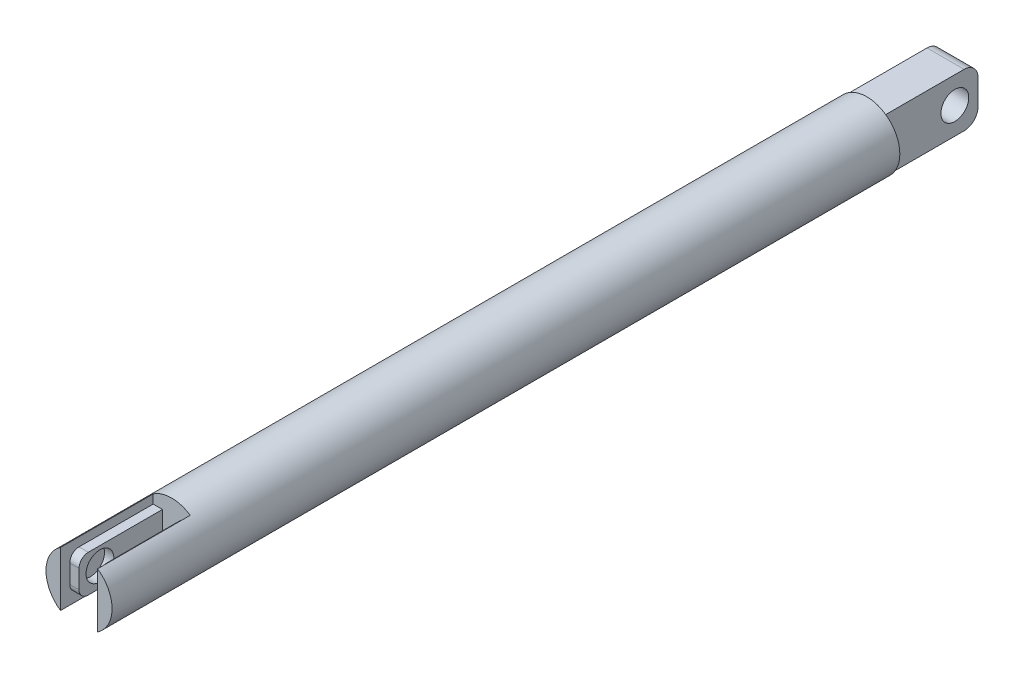
ISO-10303-21;
HEADER;
FILE_DESCRIPTION(('STEP AP214'),'2;1');
FILE_NAME('part.step','',(''),(''),'','','');
FILE_SCHEMA(('AUTOMOTIVE_DESIGN { 1 0 10303 214 1 1 1 1 }'));
ENDSEC;
DATA;
#1=APPLICATION_CONTEXT('core data for automotive mechanical design processes');
#2=APPLICATION_PROTOCOL_DEFINITION('international standard','automotive_design',2000,#1);
#3=PRODUCT_CONTEXT('',#1,'mechanical');
#4=PRODUCT('Part','Part','',(#3));
#5=PRODUCT_RELATED_PRODUCT_CATEGORY('part','',(#4));
#6=PRODUCT_DEFINITION_FORMATION('','',#4);
#7=PRODUCT_DEFINITION_CONTEXT('part definition',#1,'design');
#8=PRODUCT_DEFINITION('design','',#6,#7);
#9=PRODUCT_DEFINITION_SHAPE('','',#8);
#10=(LENGTH_UNIT() NAMED_UNIT(*) SI_UNIT(.MILLI.,.METRE.));
#11=(NAMED_UNIT(*) PLANE_ANGLE_UNIT() SI_UNIT($,.RADIAN.));
#12=(NAMED_UNIT(*) SI_UNIT($,.STERADIAN.) SOLID_ANGLE_UNIT());
#13=UNCERTAINTY_MEASURE_WITH_UNIT(LENGTH_MEASURE(1.E-05),#10,'distance_accuracy_value','');
#14=(GEOMETRIC_REPRESENTATION_CONTEXT(3) GLOBAL_UNCERTAINTY_ASSIGNED_CONTEXT((#13)) GLOBAL_UNIT_ASSIGNED_CONTEXT((#10,
#11,#12)) REPRESENTATION_CONTEXT('',''));
#15=CARTESIAN_POINT('',(0.,0.,0.));
#16=DIRECTION('',(0.,0.,1.));
#17=DIRECTION('',(1.,0.,0.));
#18=AXIS2_PLACEMENT_3D('',#15,#16,#17);
#19=CARTESIAN_POINT('',(4.,2.75,-167.));
#20=DIRECTION('',(-1.,0.,0.));
#21=DIRECTION('',(0.,0.,1.));
#22=AXIS2_PLACEMENT_3D('',#19,#20,#21);
#23=CYLINDRICAL_SURFACE('',#22,3.);
#24=DIRECTION('',(-1.,0.,0.));
#25=VECTOR('',#24,1.);
#26=CARTESIAN_POINT('',(4.,5.75,-167.));
#27=LINE('',#26,#25);
#28=CARTESIAN_POINT('',(4.,5.75,-167.));
#29=VERTEX_POINT('',#28);
#30=CARTESIAN_POINT('',(-4.,5.75,-167.));
#31=VERTEX_POINT('',#30);
#32=EDGE_CURVE('E197',#29,#31,#27,.T.);
#33=ORIENTED_EDGE('',*,*,#32,.F.);
#34=CARTESIAN_POINT('',(4.,2.75,-167.));
#35=DIRECTION('',(1.,0.,0.));
#36=DIRECTION('',(0.,0.,-1.));
#37=AXIS2_PLACEMENT_3D('',#34,#35,#36);
#38=CIRCLE('',#37,3.);
#39=CARTESIAN_POINT('',(4.,2.75,-170.));
#40=VERTEX_POINT('',#39);
#41=EDGE_CURVE('E51',#40,#29,#38,.T.);
#42=ORIENTED_EDGE('',*,*,#41,.F.);
#43=DIRECTION('',(-1.,0.,0.));
#44=VECTOR('',#43,1.);
#45=CARTESIAN_POINT('',(0.,2.75,-170.));
#46=LINE('',#45,#44);
#47=CARTESIAN_POINT('',(-4.,2.75,-170.));
#48=VERTEX_POINT('',#47);
#49=EDGE_CURVE('E373',#48,#40,#46,.F.);
#50=ORIENTED_EDGE('',*,*,#49,.F.);
#51=CARTESIAN_POINT('',(-4.,2.75,-167.));
#52=DIRECTION('',(1.,0.,0.));
#53=DIRECTION('',(0.,0.,-1.));
#54=AXIS2_PLACEMENT_3D('',#51,#52,#53);
#55=CIRCLE('',#54,3.);
#56=EDGE_CURVE('E11',#31,#48,#55,.F.);
#57=ORIENTED_EDGE('',*,*,#56,.F.);
#58=EDGE_LOOP('',(#33,#42,#50,#57));
#59=FACE_BOUND('',#58,.T.);
#60=ADVANCED_FACE('F43',(#59),#23,.T.);
#61=CARTESIAN_POINT('',(0.,-2.75,-167.));
#62=DIRECTION('',(1.,0.,0.));
#63=DIRECTION('',(0.,0.,-1.));
#64=AXIS2_PLACEMENT_3D('',#61,#62,#63);
#65=CYLINDRICAL_SURFACE('',#64,3.);
#66=DIRECTION('',(-1.,0.,0.));
#67=VECTOR('',#66,1.);
#68=CARTESIAN_POINT('',(0.,-2.75,-170.));
#69=LINE('',#68,#67);
#70=CARTESIAN_POINT('',(4.,-2.75,-170.));
#71=VERTEX_POINT('',#70);
#72=CARTESIAN_POINT('',(-4.,-2.75,-170.));
#73=VERTEX_POINT('',#72);
#74=EDGE_CURVE('E360',#71,#73,#69,.T.);
#75=ORIENTED_EDGE('',*,*,#74,.F.);
#76=CARTESIAN_POINT('',(4.,-2.75,-167.));
#77=DIRECTION('',(1.,0.,0.));
#78=DIRECTION('',(0.,0.,-1.));
#79=AXIS2_PLACEMENT_3D('',#76,#77,#78);
#80=CIRCLE('',#79,3.);
#81=CARTESIAN_POINT('',(4.,-5.75,-167.));
#82=VERTEX_POINT('',#81);
#83=EDGE_CURVE('E368',#82,#71,#80,.T.);
#84=ORIENTED_EDGE('',*,*,#83,.F.);
#85=DIRECTION('',(-1.,0.,0.));
#86=VECTOR('',#85,1.);
#87=CARTESIAN_POINT('',(0.,-5.75,-167.));
#88=LINE('',#87,#86);
#89=CARTESIAN_POINT('',(-4.,-5.75,-167.));
#90=VERTEX_POINT('',#89);
#91=EDGE_CURVE('E365',#90,#82,#88,.F.);
#92=ORIENTED_EDGE('',*,*,#91,.F.);
#93=CARTESIAN_POINT('',(-4.,-2.75,-167.));
#94=DIRECTION('',(1.,0.,0.));
#95=DIRECTION('',(0.,0.,-1.));
#96=AXIS2_PLACEMENT_3D('',#93,#94,#95);
#97=CIRCLE('',#96,3.);
#98=EDGE_CURVE('E370',#73,#90,#97,.F.);
#99=ORIENTED_EDGE('',*,*,#98,.F.);
#100=EDGE_LOOP('',(#75,#84,#92,#99));
#101=FACE_BOUND('',#100,.T.);
#102=ADVANCED_FACE('F405',(#101),#65,.T.);
#103=CARTESIAN_POINT('',(0.,0.,0.));
#104=DIRECTION('',(0.,0.,1.));
#105=DIRECTION('',(1.,0.,0.));
#106=AXIS2_PLACEMENT_3D('',#103,#104,#105);
#107=PLANE('',#106);
#108=CARTESIAN_POINT('',(0.,0.,0.));
#109=DIRECTION('',(0.,0.,1.));
#110=DIRECTION('',(1.,0.,0.));
#111=AXIS2_PLACEMENT_3D('',#108,#109,#110);
#112=CIRCLE('',#111,7.12948345739197);
#113=CARTESIAN_POINT('',(-3.99999999999998,-5.90165522283587,0.));
#114=VERTEX_POINT('',#113);
#115=CARTESIAN_POINT('',(4.00000000000002,-5.90165522283584,0.));
#116=VERTEX_POINT('',#115);
#117=EDGE_CURVE('E299',#114,#116,#112,.T.);
#118=ORIENTED_EDGE('',*,*,#117,.T.);
#119=DIRECTION('',(0.,-1.,0.));
#120=VECTOR('',#119,1.);
#121=CARTESIAN_POINT('',(4.,0.,0.));
#122=LINE('',#121,#120);
#123=CARTESIAN_POINT('',(4.,-4.,0.));
#124=VERTEX_POINT('',#123);
#125=EDGE_CURVE('E225',#124,#116,#122,.T.);
#126=ORIENTED_EDGE('',*,*,#125,.F.);
#127=DIRECTION('',(1.,0.,0.));
#128=VECTOR('',#127,1.);
#129=CARTESIAN_POINT('',(0.,-4.,0.));
#130=LINE('',#129,#128);
#131=CARTESIAN_POINT('',(2.,-4.,0.));
#132=VERTEX_POINT('',#131);
#133=EDGE_CURVE('E282',#132,#124,#130,.T.);
#134=ORIENTED_EDGE('',*,*,#133,.F.);
#135=DIRECTION('',(0.,1.,0.));
#136=VECTOR('',#135,1.);
#137=CARTESIAN_POINT('',(2.,0.,0.));
#138=LINE('',#137,#136);
#139=CARTESIAN_POINT('',(2.,4.,0.));
#140=VERTEX_POINT('',#139);
#141=EDGE_CURVE('E279',#132,#140,#138,.T.);
#142=ORIENTED_EDGE('',*,*,#141,.T.);
#143=DIRECTION('',(1.,0.,0.));
#144=VECTOR('',#143,1.);
#145=CARTESIAN_POINT('',(0.,4.,0.));
#146=LINE('',#145,#144);
#147=CARTESIAN_POINT('',(4.,4.,0.));
#148=VERTEX_POINT('',#147);
#149=EDGE_CURVE('E276',#140,#148,#146,.T.);
#150=ORIENTED_EDGE('',*,*,#149,.T.);
#151=CARTESIAN_POINT('',(3.99999999999998,5.90165522283587,0.));
#152=VERTEX_POINT('',#151);
#153=EDGE_CURVE('E233',#152,#148,#122,.T.);
#154=ORIENTED_EDGE('',*,*,#153,.F.);
#155=CARTESIAN_POINT('',(-4.00000000000002,5.90165522283584,0.));
#156=VERTEX_POINT('',#155);
#157=EDGE_CURVE('E294',#152,#156,#112,.T.);
#158=ORIENTED_EDGE('',*,*,#157,.T.);
#159=DIRECTION('',(0.,-1.,0.));
#160=VECTOR('',#159,1.);
#161=CARTESIAN_POINT('',(-4.,0.,0.));
#162=LINE('',#161,#160);
#163=CARTESIAN_POINT('',(-4.00000000000001,4.,0.));
#164=VERTEX_POINT('',#163);
#165=EDGE_CURVE('E249',#156,#164,#162,.T.);
#166=ORIENTED_EDGE('',*,*,#165,.T.);
#167=DIRECTION('',(-1.,0.,0.));
#168=VECTOR('',#167,1.);
#169=CARTESIAN_POINT('',(0.,4.,0.));
#170=LINE('',#169,#168);
#171=CARTESIAN_POINT('',(-2.,4.,0.));
#172=VERTEX_POINT('',#171);
#173=EDGE_CURVE('E298',#172,#164,#170,.T.);
#174=ORIENTED_EDGE('',*,*,#173,.F.);
#175=DIRECTION('',(0.,1.,0.));
#176=VECTOR('',#175,1.);
#177=CARTESIAN_POINT('',(-2.,0.,0.));
#178=LINE('',#177,#176);
#179=CARTESIAN_POINT('',(-2.,-4.,0.));
#180=VERTEX_POINT('',#179);
#181=EDGE_CURVE('E307',#180,#172,#178,.T.);
#182=ORIENTED_EDGE('',*,*,#181,.F.);
#183=DIRECTION('',(-1.,0.,0.));
#184=VECTOR('',#183,1.);
#185=CARTESIAN_POINT('',(0.,-4.,0.));
#186=LINE('',#185,#184);
#187=CARTESIAN_POINT('',(-3.99999999999998,-4.,0.));
#188=VERTEX_POINT('',#187);
#189=EDGE_CURVE('E304',#180,#188,#186,.T.);
#190=ORIENTED_EDGE('',*,*,#189,.T.);
#191=EDGE_CURVE('E244',#188,#114,#162,.T.);
#192=ORIENTED_EDGE('',*,*,#191,.T.);
#193=EDGE_LOOP('',(#118,#126,#134,#142,#150,#154,#158,#166,#174,#182,#190,#192));
#194=FACE_BOUND('',#193,.T.);
#195=ADVANCED_FACE('F409',(#194),#107,.T.);
#196=CARTESIAN_POINT('',(0.,2.,16.));
#197=DIRECTION('',(1.,0.,0.));
#198=DIRECTION('',(0.,0.,-1.));
#199=AXIS2_PLACEMENT_3D('',#196,#197,#198);
#200=CYLINDRICAL_SURFACE('',#199,2.);
#201=DIRECTION('',(1.,0.,0.));
#202=VECTOR('',#201,1.);
#203=CARTESIAN_POINT('',(0.,4.,16.));
#204=LINE('',#203,#202);
#205=CARTESIAN_POINT('',(2.,4.,16.));
#206=VERTEX_POINT('',#205);
#207=CARTESIAN_POINT('',(4.,4.,16.));
#208=VERTEX_POINT('',#207);
#209=EDGE_CURVE('E350',#206,#208,#204,.T.);
#210=ORIENTED_EDGE('',*,*,#209,.F.);
#211=CARTESIAN_POINT('',(2.,2.,16.));
#212=DIRECTION('',(-1.,0.,0.));
#213=DIRECTION('',(0.,0.,1.));
#214=AXIS2_PLACEMENT_3D('',#211,#212,#213);
#215=CIRCLE('',#214,2.);
#216=CARTESIAN_POINT('',(2.,2.,18.));
#217=VERTEX_POINT('',#216);
#218=EDGE_CURVE('E356',#217,#206,#215,.T.);
#219=ORIENTED_EDGE('',*,*,#218,.F.);
#220=DIRECTION('',(1.,0.,0.));
#221=VECTOR('',#220,1.);
#222=CARTESIAN_POINT('',(0.,2.,18.));
#223=LINE('',#222,#221);
#224=CARTESIAN_POINT('',(4.,2.,18.));
#225=VERTEX_POINT('',#224);
#226=EDGE_CURVE('E353',#225,#217,#223,.F.);
#227=ORIENTED_EDGE('',*,*,#226,.F.);
#228=CARTESIAN_POINT('',(4.,2.,16.));
#229=DIRECTION('',(1.,0.,0.));
#230=DIRECTION('',(0.,0.,-1.));
#231=AXIS2_PLACEMENT_3D('',#228,#229,#230);
#232=CIRCLE('',#231,2.);
#233=EDGE_CURVE('E358',#208,#225,#232,.T.);
#234=ORIENTED_EDGE('',*,*,#233,.F.);
#235=EDGE_LOOP('',(#210,#219,#227,#234));
#236=FACE_BOUND('',#235,.T.);
#237=ADVANCED_FACE('F415',(#236),#200,.T.);
#238=CARTESIAN_POINT('',(0.,2.,16.));
#239=DIRECTION('',(-1.,0.,0.));
#240=DIRECTION('',(0.,0.,1.));
#241=AXIS2_PLACEMENT_3D('',#238,#239,#240);
#242=CYLINDRICAL_SURFACE('',#241,2.);
#243=DIRECTION('',(1.,0.,0.));
#244=VECTOR('',#243,1.);
#245=CARTESIAN_POINT('',(0.,4.,16.));
#246=LINE('',#245,#244);
#247=CARTESIAN_POINT('',(-4.00000000000001,4.,16.));
#248=VERTEX_POINT('',#247);
#249=CARTESIAN_POINT('',(-2.,4.,16.));
#250=VERTEX_POINT('',#249);
#251=EDGE_CURVE('E340',#248,#250,#246,.T.);
#252=ORIENTED_EDGE('',*,*,#251,.F.);
#253=CARTESIAN_POINT('',(-4.,2.,16.));
#254=DIRECTION('',(1.,0.,0.));
#255=DIRECTION('',(0.,0.,-1.));
#256=AXIS2_PLACEMENT_3D('',#253,#254,#255);
#257=CIRCLE('',#256,2.);
#258=CARTESIAN_POINT('',(-4.00000000000001,2.,18.));
#259=VERTEX_POINT('',#258);
#260=EDGE_CURVE('E346',#259,#248,#257,.F.);
#261=ORIENTED_EDGE('',*,*,#260,.F.);
#262=DIRECTION('',(1.,0.,0.));
#263=VECTOR('',#262,1.);
#264=CARTESIAN_POINT('',(0.,2.,18.));
#265=LINE('',#264,#263);
#266=CARTESIAN_POINT('',(-2.,2.,18.));
#267=VERTEX_POINT('',#266);
#268=EDGE_CURVE('E343',#267,#259,#265,.F.);
#269=ORIENTED_EDGE('',*,*,#268,.F.);
#270=CARTESIAN_POINT('',(-2.,2.,16.));
#271=DIRECTION('',(-1.,0.,0.));
#272=DIRECTION('',(0.,0.,1.));
#273=AXIS2_PLACEMENT_3D('',#270,#271,#272);
#274=CIRCLE('',#273,2.);
#275=EDGE_CURVE('E348',#250,#267,#274,.F.);
#276=ORIENTED_EDGE('',*,*,#275,.F.);
#277=EDGE_LOOP('',(#252,#261,#269,#276));
#278=FACE_BOUND('',#277,.T.);
#279=ADVANCED_FACE('F421',(#278),#242,.T.);
#280=CARTESIAN_POINT('',(0.,-2.,16.));
#281=DIRECTION('',(-1.,0.,0.));
#282=DIRECTION('',(0.,0.,1.));
#283=AXIS2_PLACEMENT_3D('',#280,#281,#282);
#284=CYLINDRICAL_SURFACE('',#283,2.);
#285=DIRECTION('',(1.,0.,0.));
#286=VECTOR('',#285,1.);
#287=CARTESIAN_POINT('',(0.,-2.,18.));
#288=LINE('',#287,#286);
#289=CARTESIAN_POINT('',(2.,-2.,18.));
#290=VERTEX_POINT('',#289);
#291=CARTESIAN_POINT('',(4.,-2.,18.));
#292=VERTEX_POINT('',#291);
#293=EDGE_CURVE('E329',#290,#292,#288,.T.);
#294=ORIENTED_EDGE('',*,*,#293,.F.);
#295=CARTESIAN_POINT('',(2.,-2.,16.));
#296=DIRECTION('',(-1.,0.,0.));
#297=DIRECTION('',(0.,0.,1.));
#298=AXIS2_PLACEMENT_3D('',#295,#296,#297);
#299=CIRCLE('',#298,2.);
#300=CARTESIAN_POINT('',(2.,-4.,16.));
#301=VERTEX_POINT('',#300);
#302=EDGE_CURVE('E335',#301,#290,#299,.T.);
#303=ORIENTED_EDGE('',*,*,#302,.F.);
#304=DIRECTION('',(1.,0.,0.));
#305=VECTOR('',#304,1.);
#306=CARTESIAN_POINT('',(0.,-4.,16.));
#307=LINE('',#306,#305);
#308=CARTESIAN_POINT('',(4.,-4.,16.));
#309=VERTEX_POINT('',#308);
#310=EDGE_CURVE('E332',#309,#301,#307,.F.);
#311=ORIENTED_EDGE('',*,*,#310,.F.);
#312=CARTESIAN_POINT('',(4.,-2.,16.));
#313=DIRECTION('',(1.,0.,0.));
#314=DIRECTION('',(0.,0.,-1.));
#315=AXIS2_PLACEMENT_3D('',#312,#313,#314);
#316=CIRCLE('',#315,2.);
#317=EDGE_CURVE('E338',#292,#309,#316,.T.);
#318=ORIENTED_EDGE('',*,*,#317,.F.);
#319=EDGE_LOOP('',(#294,#303,#311,#318));
#320=FACE_BOUND('',#319,.T.);
#321=ADVANCED_FACE('F425',(#320),#284,.T.);
#322=CARTESIAN_POINT('',(0.,-2.,16.));
#323=DIRECTION('',(1.,0.,0.));
#324=DIRECTION('',(0.,0.,-1.));
#325=AXIS2_PLACEMENT_3D('',#322,#323,#324);
#326=CYLINDRICAL_SURFACE('',#325,2.);
#327=DIRECTION('',(1.,0.,0.));
#328=VECTOR('',#327,1.);
#329=CARTESIAN_POINT('',(0.,-2.,18.));
#330=LINE('',#329,#328);
#331=CARTESIAN_POINT('',(-4.,-2.,18.));
#332=VERTEX_POINT('',#331);
#333=CARTESIAN_POINT('',(-2.,-2.,18.));
#334=VERTEX_POINT('',#333);
#335=EDGE_CURVE('E319',#332,#334,#330,.T.);
#336=ORIENTED_EDGE('',*,*,#335,.F.);
#337=CARTESIAN_POINT('',(-4.,-2.,16.));
#338=DIRECTION('',(1.,0.,0.));
#339=DIRECTION('',(0.,0.,-1.));
#340=AXIS2_PLACEMENT_3D('',#337,#338,#339);
#341=CIRCLE('',#340,2.);
#342=CARTESIAN_POINT('',(-3.99999999999998,-4.,16.));
#343=VERTEX_POINT('',#342);
#344=EDGE_CURVE('E325',#343,#332,#341,.F.);
#345=ORIENTED_EDGE('',*,*,#344,.F.);
#346=DIRECTION('',(1.,0.,0.));
#347=VECTOR('',#346,1.);
#348=CARTESIAN_POINT('',(0.,-4.,16.));
#349=LINE('',#348,#347);
#350=CARTESIAN_POINT('',(-2.,-4.,16.));
#351=VERTEX_POINT('',#350);
#352=EDGE_CURVE('E322',#351,#343,#349,.F.);
#353=ORIENTED_EDGE('',*,*,#352,.F.);
#354=CARTESIAN_POINT('',(-2.,-2.,16.));
#355=DIRECTION('',(-1.,0.,0.));
#356=DIRECTION('',(0.,0.,1.));
#357=AXIS2_PLACEMENT_3D('',#354,#355,#356);
#358=CIRCLE('',#357,2.);
#359=EDGE_CURVE('E327',#334,#351,#358,.F.);
#360=ORIENTED_EDGE('',*,*,#359,.F.);
#361=EDGE_LOOP('',(#336,#345,#353,#360));
#362=FACE_BOUND('',#361,.T.);
#363=ADVANCED_FACE('F429',(#362),#326,.T.);
#364=CARTESIAN_POINT('',(0.,4.,8.));
#365=DIRECTION('',(0.,-1.,0.));
#366=DIRECTION('',(0.,0.,-1.));
#367=AXIS2_PLACEMENT_3D('',#364,#365,#366);
#368=PLANE('',#367);
#369=DIRECTION('',(0.,0.,-1.));
#370=VECTOR('',#369,1.);
#371=CARTESIAN_POINT('',(-4.,4.,8.));
#372=LINE('',#371,#370);
#373=EDGE_CURVE('E317',#248,#164,#372,.T.);
#374=ORIENTED_EDGE('',*,*,#373,.F.);
#375=ORIENTED_EDGE('',*,*,#251,.T.);
#376=DIRECTION('',(0.,0.,-1.));
#377=VECTOR('',#376,1.);
#378=CARTESIAN_POINT('',(-2.,4.,8.));
#379=LINE('',#378,#377);
#380=EDGE_CURVE('E310',#250,#172,#379,.T.);
#381=ORIENTED_EDGE('',*,*,#380,.T.);
#382=ORIENTED_EDGE('',*,*,#173,.T.);
#383=EDGE_LOOP('',(#374,#375,#381,#382));
#384=FACE_BOUND('',#383,.T.);
#385=ADVANCED_FACE('F433',(#384),#368,.F.);
#386=CARTESIAN_POINT('',(0.,-4.,8.));
#387=DIRECTION('',(0.,-1.,0.));
#388=DIRECTION('',(0.,0.,-1.));
#389=AXIS2_PLACEMENT_3D('',#386,#387,#388);
#390=PLANE('',#389);
#391=DIRECTION('',(0.,0.,-1.));
#392=VECTOR('',#391,1.);
#393=CARTESIAN_POINT('',(-2.,-4.,8.));
#394=LINE('',#393,#392);
#395=EDGE_CURVE('E312',#351,#180,#394,.T.);
#396=ORIENTED_EDGE('',*,*,#395,.F.);
#397=ORIENTED_EDGE('',*,*,#352,.T.);
#398=DIRECTION('',(0.,0.,-1.));
#399=VECTOR('',#398,1.);
#400=CARTESIAN_POINT('',(-4.,-4.,8.));
#401=LINE('',#400,#399);
#402=EDGE_CURVE('E314',#343,#188,#401,.T.);
#403=ORIENTED_EDGE('',*,*,#402,.T.);
#404=ORIENTED_EDGE('',*,*,#189,.F.);
#405=EDGE_LOOP('',(#396,#397,#403,#404));
#406=FACE_BOUND('',#405,.T.);
#407=ADVANCED_FACE('F437',(#406),#390,.T.);
#408=CARTESIAN_POINT('',(-2.,0.,8.));
#409=DIRECTION('',(-1.,0.,0.));
#410=DIRECTION('',(0.,0.,1.));
#411=AXIS2_PLACEMENT_3D('',#408,#409,#410);
#412=PLANE('',#411);
#413=CARTESIAN_POINT('',(-2.,0.200340445414514,13.5));
#414=DIRECTION('',(-1.,0.,0.));
#415=DIRECTION('',(0.,0.,1.));
#416=AXIS2_PLACEMENT_3D('',#413,#414,#415);
#417=CIRCLE('',#416,3.);
#418=CARTESIAN_POINT('',(-2.,0.200340445414514,16.5));
#419=VERTEX_POINT('',#418);
#420=EDGE_CURVE('E262',#419,#419,#417,.T.);
#421=ORIENTED_EDGE('',*,*,#420,.T.);
#422=EDGE_LOOP('',(#421));
#423=FACE_BOUND('',#422,.T.);
#424=ORIENTED_EDGE('',*,*,#380,.F.);
#425=ORIENTED_EDGE('',*,*,#275,.T.);
#426=DIRECTION('',(0.,1.,0.));
#427=VECTOR('',#426,1.);
#428=CARTESIAN_POINT('',(-2.,4.,18.));
#429=LINE('',#428,#427);
#430=EDGE_CURVE('E265',#334,#267,#429,.T.);
#431=ORIENTED_EDGE('',*,*,#430,.F.);
#432=ORIENTED_EDGE('',*,*,#359,.T.);
#433=ORIENTED_EDGE('',*,*,#395,.T.);
#434=ORIENTED_EDGE('',*,*,#181,.T.);
#435=EDGE_LOOP('',(#424,#425,#431,#432,#433,#434));
#436=FACE_BOUND('',#435,.T.);
#437=ADVANCED_FACE('F441',(#423,#436),#412,.F.);
#438=CARTESIAN_POINT('',(0.,0.,-150.));
#439=DIRECTION('',(0.,0.,1.));
#440=DIRECTION('',(1.,0.,0.));
#441=AXIS2_PLACEMENT_3D('',#438,#439,#440);
#442=CYLINDRICAL_SURFACE('',#441,7.12948345739197);
#443=CARTESIAN_POINT('',(0.,0.,-150.));
#444=DIRECTION('',(0.,0.,1.));
#445=DIRECTION('',(1.,0.,0.));
#446=AXIS2_PLACEMENT_3D('',#443,#444,#445);
#447=CIRCLE('',#446,7.12948345739197);
#448=CARTESIAN_POINT('',(7.12948345739197,0.,-150.));
#449=VERTEX_POINT('',#448);
#450=EDGE_CURVE('E295',#449,#449,#447,.T.);
#451=ORIENTED_EDGE('',*,*,#450,.T.);
#452=EDGE_LOOP('',(#451));
#453=FACE_BOUND('',#452,.T.);
#454=ORIENTED_EDGE('',*,*,#117,.F.);
#455=DIRECTION('',(0.,0.,-1.));
#456=VECTOR('',#455,1.);
#457=CARTESIAN_POINT('',(-3.99999999999998,-5.90165522283587,20.));
#458=LINE('',#457,#456);
#459=CARTESIAN_POINT('',(-3.99999999999998,-5.90165522283587,20.));
#460=VERTEX_POINT('',#459);
#461=EDGE_CURVE('E251',#460,#114,#458,.T.);
#462=ORIENTED_EDGE('',*,*,#461,.F.);
#463=CARTESIAN_POINT('',(0.,0.,20.));
#464=DIRECTION('',(0.,0.,1.));
#465=DIRECTION('',(1.,0.,0.));
#466=AXIS2_PLACEMENT_3D('',#463,#464,#465);
#467=CIRCLE('',#466,7.12948345739197);
#468=CARTESIAN_POINT('',(-4.00000000000002,5.90165522283584,20.));
#469=VERTEX_POINT('',#468);
#470=EDGE_CURVE('E248',#469,#460,#467,.T.);
#471=ORIENTED_EDGE('',*,*,#470,.F.);
#472=DIRECTION('',(0.,0.,-1.));
#473=VECTOR('',#472,1.);
#474=CARTESIAN_POINT('',(-4.00000000000002,5.90165522283584,20.));
#475=LINE('',#474,#473);
#476=EDGE_CURVE('E255',#469,#156,#475,.T.);
#477=ORIENTED_EDGE('',*,*,#476,.T.);
#478=ORIENTED_EDGE('',*,*,#157,.F.);
#479=DIRECTION('',(0.,0.,-1.));
#480=VECTOR('',#479,1.);
#481=CARTESIAN_POINT('',(3.99999999999998,5.90165522283587,20.));
#482=LINE('',#481,#480);
#483=CARTESIAN_POINT('',(3.99999999999998,5.90165522283587,20.));
#484=VERTEX_POINT('',#483);
#485=EDGE_CURVE('E235',#484,#152,#482,.T.);
#486=ORIENTED_EDGE('',*,*,#485,.F.);
#487=CARTESIAN_POINT('',(0.,0.,20.));
#488=DIRECTION('',(0.,0.,1.));
#489=DIRECTION('',(1.,0.,0.));
#490=AXIS2_PLACEMENT_3D('',#487,#488,#489);
#491=CIRCLE('',#490,7.12948345739197);
#492=CARTESIAN_POINT('',(4.00000000000002,-5.90165522283584,20.));
#493=VERTEX_POINT('',#492);
#494=EDGE_CURVE('E232',#493,#484,#491,.T.);
#495=ORIENTED_EDGE('',*,*,#494,.F.);
#496=DIRECTION('',(0.,0.,-1.));
#497=VECTOR('',#496,1.);
#498=CARTESIAN_POINT('',(4.00000000000002,-5.90165522283584,20.));
#499=LINE('',#498,#497);
#500=EDGE_CURVE('E238',#493,#116,#499,.T.);
#501=ORIENTED_EDGE('',*,*,#500,.T.);
#502=EDGE_LOOP('',(#454,#462,#471,#477,#478,#486,#495,#501));
#503=FACE_BOUND('',#502,.T.);
#504=ADVANCED_FACE('F445',(#453,#503),#442,.T.);
#505=CARTESIAN_POINT('',(0.,0.,-150.));
#506=DIRECTION('',(0.,0.,1.));
#507=DIRECTION('',(1.,0.,0.));
#508=AXIS2_PLACEMENT_3D('',#505,#506,#507);
#509=PLANE('',#508);
#510=DIRECTION('',(0.,1.,0.));
#511=VECTOR('',#510,1.);
#512=CARTESIAN_POINT('',(4.,-5.75,-150.));
#513=LINE('',#512,#511);
#514=CARTESIAN_POINT('',(4.,-5.75,-150.));
#515=VERTEX_POINT('',#514);
#516=CARTESIAN_POINT('',(4.,5.75,-150.));
#517=VERTEX_POINT('',#516);
#518=EDGE_CURVE('E213',#515,#517,#513,.T.);
#519=ORIENTED_EDGE('',*,*,#518,.T.);
#520=DIRECTION('',(-1.,0.,0.));
#521=VECTOR('',#520,1.);
#522=CARTESIAN_POINT('',(4.,5.75,-150.));
#523=LINE('',#522,#521);
#524=CARTESIAN_POINT('',(-4.,5.75,-150.));
#525=VERTEX_POINT('',#524);
#526=EDGE_CURVE('E195',#517,#525,#523,.T.);
#527=ORIENTED_EDGE('',*,*,#526,.T.);
#528=DIRECTION('',(0.,1.,0.));
#529=VECTOR('',#528,1.);
#530=CARTESIAN_POINT('',(-4.,-5.75,-150.));
#531=LINE('',#530,#529);
#532=CARTESIAN_POINT('',(-4.,-5.75,-150.));
#533=VERTEX_POINT('',#532);
#534=EDGE_CURVE('E202',#533,#525,#531,.T.);
#535=ORIENTED_EDGE('',*,*,#534,.F.);
#536=DIRECTION('',(-1.,0.,0.));
#537=VECTOR('',#536,1.);
#538=CARTESIAN_POINT('',(4.,-5.75,-150.));
#539=LINE('',#538,#537);
#540=EDGE_CURVE('E208',#515,#533,#539,.T.);
#541=ORIENTED_EDGE('',*,*,#540,.F.);
#542=EDGE_LOOP('',(#519,#527,#535,#541));
#543=FACE_BOUND('',#542,.T.);
#544=ORIENTED_EDGE('',*,*,#450,.F.);
#545=EDGE_LOOP('',(#544));
#546=FACE_BOUND('',#545,.T.);
#547=ADVANCED_FACE('F210',(#543,#546),#509,.F.);
#548=CARTESIAN_POINT('',(0.,4.,8.));
#549=DIRECTION('',(0.,1.,0.));
#550=DIRECTION('',(0.,0.,1.));
#551=AXIS2_PLACEMENT_3D('',#548,#549,#550);
#552=PLANE('',#551);
#553=DIRECTION('',(0.,0.,-1.));
#554=VECTOR('',#553,1.);
#555=CARTESIAN_POINT('',(2.,4.,8.));
#556=LINE('',#555,#554);
#557=EDGE_CURVE('E289',#206,#140,#556,.T.);
#558=ORIENTED_EDGE('',*,*,#557,.F.);
#559=ORIENTED_EDGE('',*,*,#209,.T.);
#560=DIRECTION('',(0.,0.,-1.));
#561=VECTOR('',#560,1.);
#562=CARTESIAN_POINT('',(4.,4.,8.));
#563=LINE('',#562,#561);
#564=EDGE_CURVE('E291',#208,#148,#563,.T.);
#565=ORIENTED_EDGE('',*,*,#564,.T.);
#566=ORIENTED_EDGE('',*,*,#149,.F.);
#567=EDGE_LOOP('',(#558,#559,#565,#566));
#568=FACE_BOUND('',#567,.T.);
#569=ADVANCED_FACE('F451',(#568),#552,.T.);
#570=CARTESIAN_POINT('',(2.,0.,8.));
#571=DIRECTION('',(-1.,0.,0.));
#572=DIRECTION('',(0.,0.,1.));
#573=AXIS2_PLACEMENT_3D('',#570,#571,#572);
#574=PLANE('',#573);
#575=CARTESIAN_POINT('',(2.,0.200340445414514,13.5));
#576=DIRECTION('',(-1.,0.,0.));
#577=DIRECTION('',(0.,0.,1.));
#578=AXIS2_PLACEMENT_3D('',#575,#576,#577);
#579=CIRCLE('',#578,3.);
#580=CARTESIAN_POINT('',(2.,0.200340445414514,16.5));
#581=VERTEX_POINT('',#580);
#582=EDGE_CURVE('E261',#581,#581,#579,.T.);
#583=ORIENTED_EDGE('',*,*,#582,.F.);
#584=EDGE_LOOP('',(#583));
#585=FACE_BOUND('',#584,.T.);
#586=DIRECTION('',(0.,-1.,0.));
#587=VECTOR('',#586,1.);
#588=CARTESIAN_POINT('',(2.,4.,18.));
#589=LINE('',#588,#587);
#590=EDGE_CURVE('E271',#217,#290,#589,.T.);
#591=ORIENTED_EDGE('',*,*,#590,.F.);
#592=ORIENTED_EDGE('',*,*,#218,.T.);
#593=ORIENTED_EDGE('',*,*,#557,.T.);
#594=ORIENTED_EDGE('',*,*,#141,.F.);
#595=DIRECTION('',(0.,0.,-1.));
#596=VECTOR('',#595,1.);
#597=CARTESIAN_POINT('',(2.,-4.,8.));
#598=LINE('',#597,#596);
#599=EDGE_CURVE('E287',#301,#132,#598,.T.);
#600=ORIENTED_EDGE('',*,*,#599,.F.);
#601=ORIENTED_EDGE('',*,*,#302,.T.);
#602=EDGE_LOOP('',(#591,#592,#593,#594,#600,#601));
#603=FACE_BOUND('',#602,.T.);
#604=ADVANCED_FACE('F454',(#585,#603),#574,.T.);
#605=CARTESIAN_POINT('',(0.,-4.,8.));
#606=DIRECTION('',(0.,1.,0.));
#607=DIRECTION('',(0.,0.,1.));
#608=AXIS2_PLACEMENT_3D('',#605,#606,#607);
#609=PLANE('',#608);
#610=DIRECTION('',(0.,0.,-1.));
#611=VECTOR('',#610,1.);
#612=CARTESIAN_POINT('',(4.,-4.,8.));
#613=LINE('',#612,#611);
#614=EDGE_CURVE('E285',#309,#124,#613,.T.);
#615=ORIENTED_EDGE('',*,*,#614,.F.);
#616=ORIENTED_EDGE('',*,*,#310,.T.);
#617=ORIENTED_EDGE('',*,*,#599,.T.);
#618=ORIENTED_EDGE('',*,*,#133,.T.);
#619=EDGE_LOOP('',(#615,#616,#617,#618));
#620=FACE_BOUND('',#619,.T.);
#621=ADVANCED_FACE('F458',(#620),#609,.F.);
#622=CARTESIAN_POINT('',(0.,0.,18.));
#623=DIRECTION('',(0.,0.,1.));
#624=DIRECTION('',(1.,0.,0.));
#625=AXIS2_PLACEMENT_3D('',#622,#623,#624);
#626=PLANE('',#625);
#627=DIRECTION('',(0.,1.,0.));
#628=VECTOR('',#627,1.);
#629=CARTESIAN_POINT('',(4.,4.,18.));
#630=LINE('',#629,#628);
#631=EDGE_CURVE('E273',#292,#225,#630,.T.);
#632=ORIENTED_EDGE('',*,*,#631,.T.);
#633=ORIENTED_EDGE('',*,*,#226,.T.);
#634=ORIENTED_EDGE('',*,*,#590,.T.);
#635=ORIENTED_EDGE('',*,*,#293,.T.);
#636=EDGE_LOOP('',(#632,#633,#634,#635));
#637=FACE_BOUND('',#636,.T.);
#638=ADVANCED_FACE('F462',(#637),#626,.T.);
#639=CARTESIAN_POINT('',(0.,0.,18.));
#640=DIRECTION('',(0.,0.,1.));
#641=DIRECTION('',(1.,0.,0.));
#642=AXIS2_PLACEMENT_3D('',#639,#640,#641);
#643=PLANE('',#642);
#644=ORIENTED_EDGE('',*,*,#430,.T.);
#645=ORIENTED_EDGE('',*,*,#268,.T.);
#646=DIRECTION('',(0.,-1.,0.));
#647=VECTOR('',#646,1.);
#648=CARTESIAN_POINT('',(-4.,4.,18.));
#649=LINE('',#648,#647);
#650=EDGE_CURVE('E268',#259,#332,#649,.T.);
#651=ORIENTED_EDGE('',*,*,#650,.T.);
#652=ORIENTED_EDGE('',*,*,#335,.T.);
#653=EDGE_LOOP('',(#644,#645,#651,#652));
#654=FACE_BOUND('',#653,.T.);
#655=ADVANCED_FACE('F466',(#654),#643,.T.);
#656=CARTESIAN_POINT('',(6.,0.200340445414514,13.5));
#657=DIRECTION('',(-1.,0.,0.));
#658=DIRECTION('',(0.,0.,1.));
#659=AXIS2_PLACEMENT_3D('',#656,#657,#658);
#660=CYLINDRICAL_SURFACE('',#659,3.);
#661=CARTESIAN_POINT('',(4.,0.200340445414514,13.5));
#662=DIRECTION('',(1.,0.,0.));
#663=DIRECTION('',(0.,0.,-1.));
#664=AXIS2_PLACEMENT_3D('',#661,#662,#663);
#665=CIRCLE('',#664,3.);
#666=CARTESIAN_POINT('',(4.,0.200340445414514,10.5));
#667=VERTEX_POINT('',#666);
#668=EDGE_CURVE('E241',#667,#667,#665,.F.);
#669=ORIENTED_EDGE('',*,*,#668,.F.);
#670=EDGE_LOOP('',(#669));
#671=FACE_BOUND('',#670,.T.);
#672=ORIENTED_EDGE('',*,*,#582,.T.);
#673=EDGE_LOOP('',(#672));
#674=FACE_BOUND('',#673,.T.);
#675=ADVANCED_FACE('F470',(#671,#674),#660,.F.);
#676=CARTESIAN_POINT('',(-4.,0.200340445414514,13.5));
#677=DIRECTION('',(1.,0.,0.));
#678=DIRECTION('',(0.,1.,0.));
#679=AXIS2_PLACEMENT_3D('',#676,#677,#678);
#680=CIRCLE('',#679,3.);
#681=CARTESIAN_POINT('',(-4.00000000000001,3.20034044541451,13.5));
#682=VERTEX_POINT('',#681);
#683=EDGE_CURVE('E258',#682,#682,#680,.F.);
#684=ORIENTED_EDGE('',*,*,#683,.T.);
#685=EDGE_LOOP('',(#684));
#686=FACE_BOUND('',#685,.T.);
#687=ORIENTED_EDGE('',*,*,#420,.F.);
#688=EDGE_LOOP('',(#687));
#689=FACE_BOUND('',#688,.T.);
#690=ADVANCED_FACE('F474',(#686,#689),#660,.F.);
#691=CARTESIAN_POINT('',(-4.,0.,20.));
#692=DIRECTION('',(1.,0.,0.));
#693=DIRECTION('',(0.,1.,0.));
#694=AXIS2_PLACEMENT_3D('',#691,#692,#693);
#695=PLANE('',#694);
#696=ORIENTED_EDGE('',*,*,#683,.F.);
#697=EDGE_LOOP('',(#696));
#698=FACE_BOUND('',#697,.T.);
#699=ADVANCED_FACE('F480',(#698),#695,.T.);
#700=ORIENTED_EDGE('',*,*,#373,.T.);
#701=ORIENTED_EDGE('',*,*,#165,.F.);
#702=ORIENTED_EDGE('',*,*,#476,.F.);
#703=DIRECTION('',(0.,-1.,0.));
#704=VECTOR('',#703,1.);
#705=CARTESIAN_POINT('',(-4.,0.,20.));
#706=LINE('',#705,#704);
#707=EDGE_CURVE('E245',#469,#460,#706,.T.);
#708=ORIENTED_EDGE('',*,*,#707,.T.);
#709=ORIENTED_EDGE('',*,*,#461,.T.);
#710=ORIENTED_EDGE('',*,*,#191,.F.);
#711=ORIENTED_EDGE('',*,*,#402,.F.);
#712=ORIENTED_EDGE('',*,*,#344,.T.);
#713=ORIENTED_EDGE('',*,*,#650,.F.);
#714=ORIENTED_EDGE('',*,*,#260,.T.);
#715=EDGE_LOOP('',(#700,#701,#702,#708,#709,#710,#711,#712,#713,#714));
#716=FACE_BOUND('',#715,.T.);
#717=ADVANCED_FACE('F476',(#716),#695,.T.);
#718=CARTESIAN_POINT('',(0.,0.,20.));
#719=DIRECTION('',(0.,0.,1.));
#720=DIRECTION('',(1.,0.,0.));
#721=AXIS2_PLACEMENT_3D('',#718,#719,#720);
#722=PLANE('',#721);
#723=ORIENTED_EDGE('',*,*,#707,.F.);
#724=ORIENTED_EDGE('',*,*,#470,.T.);
#725=EDGE_LOOP('',(#723,#724));
#726=FACE_BOUND('',#725,.T.);
#727=ADVANCED_FACE('F479',(#726),#722,.T.);
#728=CARTESIAN_POINT('',(4.,0.,20.));
#729=DIRECTION('',(1.,0.,0.));
#730=DIRECTION('',(0.,0.,-1.));
#731=AXIS2_PLACEMENT_3D('',#728,#729,#730);
#732=PLANE('',#731);
#733=ORIENTED_EDGE('',*,*,#668,.T.);
#734=EDGE_LOOP('',(#733));
#735=FACE_BOUND('',#734,.T.);
#736=ADVANCED_FACE('F484',(#735),#732,.F.);
#737=ORIENTED_EDGE('',*,*,#564,.F.);
#738=ORIENTED_EDGE('',*,*,#233,.T.);
#739=ORIENTED_EDGE('',*,*,#631,.F.);
#740=ORIENTED_EDGE('',*,*,#317,.T.);
#741=ORIENTED_EDGE('',*,*,#614,.T.);
#742=ORIENTED_EDGE('',*,*,#125,.T.);
#743=ORIENTED_EDGE('',*,*,#500,.F.);
#744=DIRECTION('',(0.,-1.,0.));
#745=VECTOR('',#744,1.);
#746=CARTESIAN_POINT('',(4.,0.,20.));
#747=LINE('',#746,#745);
#748=EDGE_CURVE('E229',#484,#493,#747,.T.);
#749=ORIENTED_EDGE('',*,*,#748,.F.);
#750=ORIENTED_EDGE('',*,*,#485,.T.);
#751=ORIENTED_EDGE('',*,*,#153,.T.);
#752=EDGE_LOOP('',(#737,#738,#739,#740,#741,#742,#743,#749,#750,#751));
#753=FACE_BOUND('',#752,.T.);
#754=ADVANCED_FACE('F486',(#753),#732,.F.);
#755=CARTESIAN_POINT('',(0.,0.,20.));
#756=DIRECTION('',(0.,0.,1.));
#757=DIRECTION('',(1.,0.,0.));
#758=AXIS2_PLACEMENT_3D('',#755,#756,#757);
#759=PLANE('',#758);
#760=ORIENTED_EDGE('',*,*,#748,.T.);
#761=ORIENTED_EDGE('',*,*,#494,.T.);
#762=EDGE_LOOP('',(#760,#761));
#763=FACE_BOUND('',#762,.T.);
#764=ADVANCED_FACE('F401',(#763),#759,.T.);
#765=CARTESIAN_POINT('',(4.,5.75,-170.));
#766=DIRECTION('',(0.,1.,0.));
#767=DIRECTION('',(0.,0.,1.));
#768=AXIS2_PLACEMENT_3D('',#765,#766,#767);
#769=PLANE('',#768);
#770=DIRECTION('',(0.,0.,1.));
#771=VECTOR('',#770,1.);
#772=CARTESIAN_POINT('',(4.,5.75,-170.));
#773=LINE('',#772,#771);
#774=EDGE_CURVE('E223',#29,#517,#773,.T.);
#775=ORIENTED_EDGE('',*,*,#774,.F.);
#776=ORIENTED_EDGE('',*,*,#32,.T.);
#777=DIRECTION('',(0.,0.,1.));
#778=VECTOR('',#777,1.);
#779=CARTESIAN_POINT('',(-4.,5.75,-170.));
#780=LINE('',#779,#778);
#781=EDGE_CURVE('E190',#31,#525,#780,.T.);
#782=ORIENTED_EDGE('',*,*,#781,.T.);
#783=ORIENTED_EDGE('',*,*,#526,.F.);
#784=EDGE_LOOP('',(#775,#776,#782,#783));
#785=FACE_BOUND('',#784,.T.);
#786=ADVANCED_FACE('F193',(#785),#769,.T.);
#787=CARTESIAN_POINT('',(4.,-5.75,-170.));
#788=DIRECTION('',(1.,0.,0.));
#789=DIRECTION('',(0.,0.,-1.));
#790=AXIS2_PLACEMENT_3D('',#787,#788,#789);
#791=PLANE('',#790);
#792=CARTESIAN_POINT('',(4.,0.,-165.));
#793=DIRECTION('',(1.,0.,0.));
#794=DIRECTION('',(0.,0.,-1.));
#795=AXIS2_PLACEMENT_3D('',#792,#793,#794);
#796=CIRCLE('',#795,2.99999999999999);
#797=CARTESIAN_POINT('',(4.,0.,-168.));
#798=VERTEX_POINT('',#797);
#799=EDGE_CURVE('E216',#798,#798,#796,.T.);
#800=ORIENTED_EDGE('',*,*,#799,.F.);
#801=EDGE_LOOP('',(#800));
#802=FACE_BOUND('',#801,.T.);
#803=DIRECTION('',(0.,1.,0.));
#804=VECTOR('',#803,1.);
#805=CARTESIAN_POINT('',(4.,-5.75,-170.));
#806=LINE('',#805,#804);
#807=EDGE_CURVE('E199',#71,#40,#806,.T.);
#808=ORIENTED_EDGE('',*,*,#807,.T.);
#809=ORIENTED_EDGE('',*,*,#41,.T.);
#810=ORIENTED_EDGE('',*,*,#774,.T.);
#811=ORIENTED_EDGE('',*,*,#518,.F.);
#812=DIRECTION('',(0.,0.,1.));
#813=VECTOR('',#812,1.);
#814=CARTESIAN_POINT('',(4.,-5.75,-170.));
#815=LINE('',#814,#813);
#816=EDGE_CURVE('E226',#82,#515,#815,.T.);
#817=ORIENTED_EDGE('',*,*,#816,.F.);
#818=ORIENTED_EDGE('',*,*,#83,.T.);
#819=EDGE_LOOP('',(#808,#809,#810,#811,#817,#818));
#820=FACE_BOUND('',#819,.T.);
#821=ADVANCED_FACE('F377',(#802,#820),#791,.T.);
#822=CARTESIAN_POINT('',(4.,-5.75,-170.));
#823=DIRECTION('',(0.,1.,0.));
#824=DIRECTION('',(0.,0.,1.));
#825=AXIS2_PLACEMENT_3D('',#822,#823,#824);
#826=PLANE('',#825);
#827=DIRECTION('',(0.,0.,1.));
#828=VECTOR('',#827,1.);
#829=CARTESIAN_POINT('',(-4.,-5.75,-170.));
#830=LINE('',#829,#828);
#831=EDGE_CURVE('E198',#90,#533,#830,.T.);
#832=ORIENTED_EDGE('',*,*,#831,.F.);
#833=ORIENTED_EDGE('',*,*,#91,.T.);
#834=ORIENTED_EDGE('',*,*,#816,.T.);
#835=ORIENTED_EDGE('',*,*,#540,.T.);
#836=EDGE_LOOP('',(#832,#833,#834,#835));
#837=FACE_BOUND('',#836,.T.);
#838=ADVANCED_FACE('F391',(#837),#826,.F.);
#839=CARTESIAN_POINT('',(-4.,-5.75,-170.));
#840=DIRECTION('',(1.,0.,0.));
#841=DIRECTION('',(0.,0.,-1.));
#842=AXIS2_PLACEMENT_3D('',#839,#840,#841);
#843=PLANE('',#842);
#844=CARTESIAN_POINT('',(-4.,0.,-165.));
#845=DIRECTION('',(1.,0.,0.));
#846=DIRECTION('',(0.,0.,-1.));
#847=AXIS2_PLACEMENT_3D('',#844,#845,#846);
#848=CIRCLE('',#847,2.99999999999999);
#849=CARTESIAN_POINT('',(-4.,0.,-168.));
#850=VERTEX_POINT('',#849);
#851=EDGE_CURVE('E46',#850,#850,#848,.T.);
#852=ORIENTED_EDGE('',*,*,#851,.T.);
#853=EDGE_LOOP('',(#852));
#854=FACE_BOUND('',#853,.T.);
#855=ORIENTED_EDGE('',*,*,#781,.F.);
#856=ORIENTED_EDGE('',*,*,#56,.T.);
#857=DIRECTION('',(0.,1.,0.));
#858=VECTOR('',#857,1.);
#859=CARTESIAN_POINT('',(-4.,-5.75,-170.));
#860=LINE('',#859,#858);
#861=EDGE_CURVE('E222',#73,#48,#860,.T.);
#862=ORIENTED_EDGE('',*,*,#861,.F.);
#863=ORIENTED_EDGE('',*,*,#98,.T.);
#864=ORIENTED_EDGE('',*,*,#831,.T.);
#865=ORIENTED_EDGE('',*,*,#534,.T.);
#866=EDGE_LOOP('',(#855,#856,#862,#863,#864,#865));
#867=FACE_BOUND('',#866,.T.);
#868=ADVANCED_FACE('F203',(#854,#867),#843,.F.);
#869=CARTESIAN_POINT('',(0.,0.,-170.));
#870=DIRECTION('',(0.,0.,-1.));
#871=DIRECTION('',(-1.,0.,0.));
#872=AXIS2_PLACEMENT_3D('',#869,#870,#871);
#873=PLANE('',#872);
#874=ORIENTED_EDGE('',*,*,#861,.T.);
#875=ORIENTED_EDGE('',*,*,#49,.T.);
#876=ORIENTED_EDGE('',*,*,#807,.F.);
#877=ORIENTED_EDGE('',*,*,#74,.T.);
#878=EDGE_LOOP('',(#874,#875,#876,#877));
#879=FACE_BOUND('',#878,.T.);
#880=ADVANCED_FACE('F381',(#879),#873,.T.);
#881=CARTESIAN_POINT('',(-16.,0.,-165.));
#882=DIRECTION('',(1.,0.,0.));
#883=DIRECTION('',(0.,0.,-1.));
#884=AXIS2_PLACEMENT_3D('',#881,#882,#883);
#885=CYLINDRICAL_SURFACE('',#884,2.99999999999999);
#886=ORIENTED_EDGE('',*,*,#799,.T.);
#887=EDGE_LOOP('',(#886));
#888=FACE_BOUND('',#887,.T.);
#889=ORIENTED_EDGE('',*,*,#851,.F.);
#890=EDGE_LOOP('',(#889));
#891=FACE_BOUND('',#890,.T.);
#892=ADVANCED_FACE('F387',(#888,#891),#885,.F.);
#893=CLOSED_SHELL('',(#60,#102,#195,#237,#279,#321,#363,#385,#407,#437,#504,#547,#569,#604,#621,
#638,#655,#675,#690,#699,#717,#727,#736,#754,#764,#786,#821,#838,#868,#880,#892));
#894=MANIFOLD_SOLID_BREP('B2',#893);
#895=ADVANCED_BREP_SHAPE_REPRESENTATION('',(#18,#894),#14);
#896=SHAPE_DEFINITION_REPRESENTATION(#9,#895);
ENDSEC;
END-ISO-10303-21;
